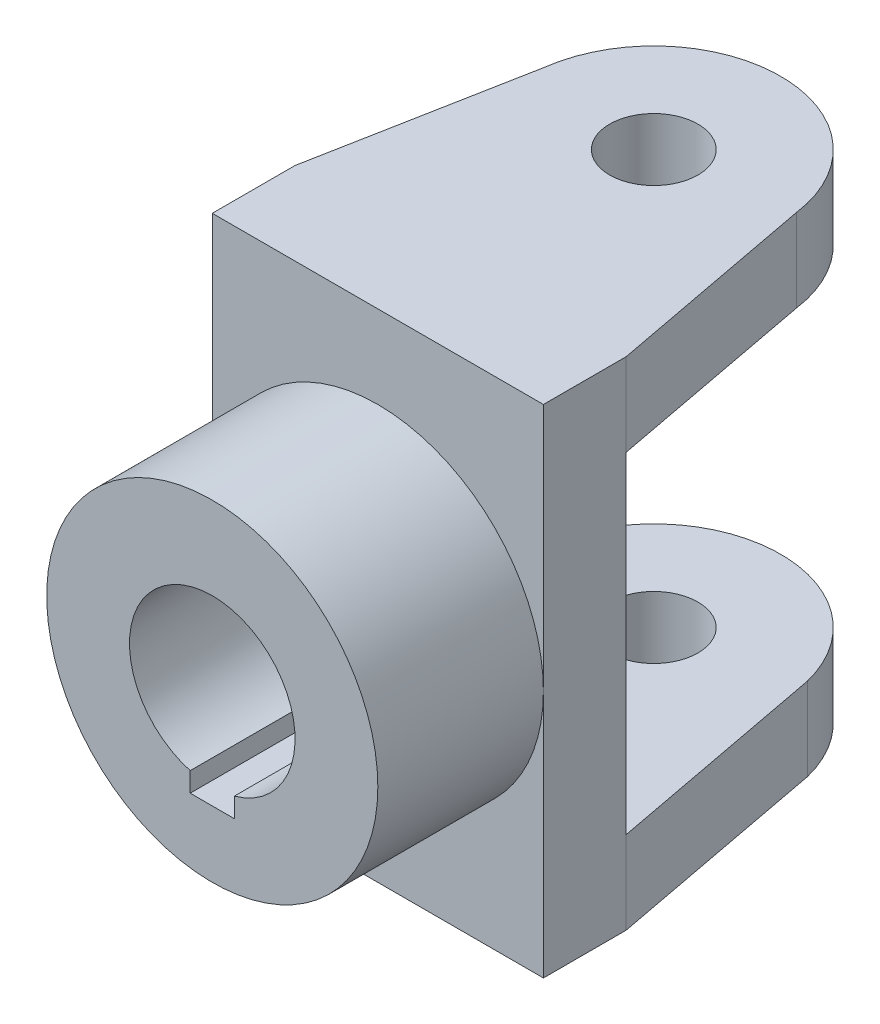
ISO-10303-21;
HEADER;
FILE_DESCRIPTION(('STEP AP214'),'2;1');
FILE_NAME('part.step','',(''),(''),'','','');
FILE_SCHEMA(('AUTOMOTIVE_DESIGN { 1 0 10303 214 1 1 1 1 }'));
ENDSEC;
DATA;
#1=APPLICATION_CONTEXT('core data for automotive mechanical design processes');
#2=APPLICATION_PROTOCOL_DEFINITION('international standard','automotive_design',2000,#1);
#3=PRODUCT_CONTEXT('',#1,'mechanical');
#4=PRODUCT('Part','Part','',(#3));
#5=PRODUCT_RELATED_PRODUCT_CATEGORY('part','',(#4));
#6=PRODUCT_DEFINITION_FORMATION('','',#4);
#7=PRODUCT_DEFINITION_CONTEXT('part definition',#1,'design');
#8=PRODUCT_DEFINITION('design','',#6,#7);
#9=PRODUCT_DEFINITION_SHAPE('','',#8);
#10=(LENGTH_UNIT() NAMED_UNIT(*) SI_UNIT(.MILLI.,.METRE.));
#11=(NAMED_UNIT(*) PLANE_ANGLE_UNIT() SI_UNIT($,.RADIAN.));
#12=(NAMED_UNIT(*) SI_UNIT($,.STERADIAN.) SOLID_ANGLE_UNIT());
#13=UNCERTAINTY_MEASURE_WITH_UNIT(LENGTH_MEASURE(1.E-05),#10,'distance_accuracy_value','');
#14=(GEOMETRIC_REPRESENTATION_CONTEXT(3) GLOBAL_UNCERTAINTY_ASSIGNED_CONTEXT((#13)) GLOBAL_UNIT_ASSIGNED_CONTEXT((#10,
#11,#12)) REPRESENTATION_CONTEXT('',''));
#15=CARTESIAN_POINT('',(0.,0.,0.));
#16=DIRECTION('',(0.,0.,1.));
#17=DIRECTION('',(1.,0.,0.));
#18=AXIS2_PLACEMENT_3D('',#15,#16,#17);
#19=CARTESIAN_POINT('',(0.,0.,0.));
#20=DIRECTION('',(0.,0.,1.));
#21=DIRECTION('',(1.,0.,0.));
#22=AXIS2_PLACEMENT_3D('',#19,#20,#21);
#23=PLANE('',#22);
#24=DIRECTION('',(1.,0.,0.));
#25=VECTOR('',#24,1.);
#26=CARTESIAN_POINT('',(0.,-30.,0.));
#27=LINE('',#26,#25);
#28=CARTESIAN_POINT('',(-30.,-30.,0.));
#29=VERTEX_POINT('',#28);
#30=CARTESIAN_POINT('',(30.,-30.,0.));
#31=VERTEX_POINT('',#30);
#32=EDGE_CURVE('E183',#29,#31,#27,.T.);
#33=ORIENTED_EDGE('',*,*,#32,.F.);
#34=DIRECTION('',(0.,-1.,0.));
#35=VECTOR('',#34,1.);
#36=CARTESIAN_POINT('',(-30.,45.,0.));
#37=LINE('',#36,#35);
#38=CARTESIAN_POINT('',(-30.,30.,0.));
#39=VERTEX_POINT('',#38);
#40=EDGE_CURVE('E335',#39,#29,#37,.T.);
#41=ORIENTED_EDGE('',*,*,#40,.F.);
#42=DIRECTION('',(1.,0.,0.));
#43=VECTOR('',#42,1.);
#44=CARTESIAN_POINT('',(-30.,30.,0.));
#45=LINE('',#44,#43);
#46=CARTESIAN_POINT('',(30.,30.,0.));
#47=VERTEX_POINT('',#46);
#48=EDGE_CURVE('E247',#39,#47,#45,.T.);
#49=ORIENTED_EDGE('',*,*,#48,.T.);
#50=DIRECTION('',(0.,1.,0.));
#51=VECTOR('',#50,1.);
#52=CARTESIAN_POINT('',(30.,45.,0.));
#53=LINE('',#52,#51);
#54=EDGE_CURVE('E76',#31,#47,#53,.T.);
#55=ORIENTED_EDGE('',*,*,#54,.F.);
#56=EDGE_LOOP('',(#33,#41,#49,#55));
#57=FACE_BOUND('',#56,.T.);
#58=ADVANCED_FACE('F58',(#57),#23,.F.);
#59=CARTESIAN_POINT('',(0.,0.,15.));
#60=DIRECTION('',(0.,0.,1.));
#61=DIRECTION('',(1.,0.,0.));
#62=AXIS2_PLACEMENT_3D('',#59,#60,#61);
#63=PLANE('',#62);
#64=CARTESIAN_POINT('',(0.,0.,15.));
#65=DIRECTION('',(0.,0.,1.));
#66=DIRECTION('',(1.,0.,0.));
#67=AXIS2_PLACEMENT_3D('',#64,#65,#66);
#68=CIRCLE('',#67,30.);
#69=CARTESIAN_POINT('',(30.,0.,15.));
#70=VERTEX_POINT('',#69);
#71=CARTESIAN_POINT('',(-30.,0.,15.));
#72=VERTEX_POINT('',#71);
#73=EDGE_CURVE('E69',#70,#72,#68,.T.);
#74=ORIENTED_EDGE('',*,*,#73,.F.);
#75=DIRECTION('',(0.,1.,0.));
#76=VECTOR('',#75,1.);
#77=CARTESIAN_POINT('',(30.,45.,15.));
#78=LINE('',#77,#76);
#79=CARTESIAN_POINT('',(30.,45.,15.));
#80=VERTEX_POINT('',#79);
#81=EDGE_CURVE('E320',#70,#80,#78,.T.);
#82=ORIENTED_EDGE('',*,*,#81,.T.);
#83=DIRECTION('',(-1.,0.,0.));
#84=VECTOR('',#83,1.);
#85=CARTESIAN_POINT('',(-30.,45.,15.));
#86=LINE('',#85,#84);
#87=CARTESIAN_POINT('',(-30.,45.,15.));
#88=VERTEX_POINT('',#87);
#89=EDGE_CURVE('E319',#80,#88,#86,.T.);
#90=ORIENTED_EDGE('',*,*,#89,.T.);
#91=DIRECTION('',(0.,-1.,0.));
#92=VECTOR('',#91,1.);
#93=CARTESIAN_POINT('',(-30.,45.,15.));
#94=LINE('',#93,#92);
#95=EDGE_CURVE('E324',#88,#72,#94,.T.);
#96=ORIENTED_EDGE('',*,*,#95,.T.);
#97=EDGE_LOOP('',(#74,#82,#90,#96));
#98=FACE_BOUND('',#97,.T.);
#99=ADVANCED_FACE('F410',(#98),#63,.T.);
#100=CARTESIAN_POINT('',(30.,45.,15.));
#101=DIRECTION('',(-1.,0.,0.));
#102=DIRECTION('',(0.,-1.,0.));
#103=AXIS2_PLACEMENT_3D('',#100,#101,#102);
#104=PLANE('',#103);
#105=CARTESIAN_POINT('',(30.,-45.,0.));
#106=VERTEX_POINT('',#105);
#107=EDGE_CURVE('E332',#106,#31,#53,.T.);
#108=ORIENTED_EDGE('',*,*,#107,.T.);
#109=ORIENTED_EDGE('',*,*,#54,.T.);
#110=DIRECTION('',(0.,1.,0.));
#111=VECTOR('',#110,1.);
#112=CARTESIAN_POINT('',(30.,30.,0.));
#113=LINE('',#112,#111);
#114=CARTESIAN_POINT('',(30.,45.,0.));
#115=VERTEX_POINT('',#114);
#116=EDGE_CURVE('E262',#47,#115,#113,.T.);
#117=ORIENTED_EDGE('',*,*,#116,.T.);
#118=DIRECTION('',(0.,0.,-1.));
#119=VECTOR('',#118,1.);
#120=CARTESIAN_POINT('',(30.,45.,15.));
#121=LINE('',#120,#119);
#122=EDGE_CURVE('E62',#80,#115,#121,.T.);
#123=ORIENTED_EDGE('',*,*,#122,.F.);
#124=ORIENTED_EDGE('',*,*,#81,.F.);
#125=CARTESIAN_POINT('',(30.,-45.,15.));
#126=VERTEX_POINT('',#125);
#127=EDGE_CURVE('E316',#126,#70,#78,.T.);
#128=ORIENTED_EDGE('',*,*,#127,.F.);
#129=DIRECTION('',(0.,0.,-1.));
#130=VECTOR('',#129,1.);
#131=CARTESIAN_POINT('',(30.,-45.,15.));
#132=LINE('',#131,#130);
#133=EDGE_CURVE('E331',#126,#106,#132,.T.);
#134=ORIENTED_EDGE('',*,*,#133,.T.);
#135=EDGE_LOOP('',(#108,#109,#117,#123,#124,#128,#134));
#136=FACE_BOUND('',#135,.T.);
#137=ADVANCED_FACE('F60',(#136),#104,.F.);
#138=CARTESIAN_POINT('',(-30.,45.,15.));
#139=DIRECTION('',(0.,-1.,0.));
#140=DIRECTION('',(0.,0.,-1.));
#141=AXIS2_PLACEMENT_3D('',#138,#139,#140);
#142=PLANE('',#141);
#143=ORIENTED_EDGE('',*,*,#122,.T.);
#144=DIRECTION('',(-0.185979050214473,0.,-0.982553709921917));
#145=VECTOR('',#144,1.);
#146=CARTESIAN_POINT('',(30.,45.,0.));
#147=LINE('',#146,#145);
#148=CARTESIAN_POINT('',(22.7945088201798,45.,-38.0676322541571));
#149=VERTEX_POINT('',#148);
#150=EDGE_CURVE('E231',#115,#149,#147,.T.);
#151=ORIENTED_EDGE('',*,*,#150,.T.);
#152=CARTESIAN_POINT('',(0.,45.,-35.));
#153=DIRECTION('',(0.,1.,0.));
#154=DIRECTION('',(0.,0.,1.));
#155=AXIS2_PLACEMENT_3D('',#152,#153,#154);
#156=CIRCLE('',#155,23.);
#157=CARTESIAN_POINT('',(-22.7945088201798,45.,-38.0676322541571));
#158=VERTEX_POINT('',#157);
#159=EDGE_CURVE('E255',#149,#158,#156,.T.);
#160=ORIENTED_EDGE('',*,*,#159,.T.);
#161=DIRECTION('',(0.185979050214473,0.,-0.982553709921917));
#162=VECTOR('',#161,1.);
#163=CARTESIAN_POINT('',(-30.,45.,0.));
#164=LINE('',#163,#162);
#165=CARTESIAN_POINT('',(-30.,45.,0.));
#166=VERTEX_POINT('',#165);
#167=EDGE_CURVE('E240',#166,#158,#164,.T.);
#168=ORIENTED_EDGE('',*,*,#167,.F.);
#169=DIRECTION('',(0.,0.,-1.));
#170=VECTOR('',#169,1.);
#171=CARTESIAN_POINT('',(-30.,45.,15.));
#172=LINE('',#171,#170);
#173=EDGE_CURVE('E346',#88,#166,#172,.T.);
#174=ORIENTED_EDGE('',*,*,#173,.F.);
#175=ORIENTED_EDGE('',*,*,#89,.F.);
#176=EDGE_LOOP('',(#143,#151,#160,#168,#174,#175));
#177=FACE_BOUND('',#176,.T.);
#178=CARTESIAN_POINT('',(0.,45.,-35.));
#179=DIRECTION('',(0.,1.,0.));
#180=DIRECTION('',(0.,0.,1.));
#181=AXIS2_PLACEMENT_3D('',#178,#179,#180);
#182=CIRCLE('',#181,8.);
#183=CARTESIAN_POINT('',(0.,45.,-27.));
#184=VERTEX_POINT('',#183);
#185=EDGE_CURVE('E224',#184,#184,#182,.T.);
#186=ORIENTED_EDGE('',*,*,#185,.F.);
#187=EDGE_LOOP('',(#186));
#188=FACE_BOUND('',#187,.T.);
#189=ADVANCED_FACE('F357',(#177,#188),#142,.F.);
#190=CARTESIAN_POINT('',(-30.,45.,15.));
#191=DIRECTION('',(1.,0.,0.));
#192=DIRECTION('',(0.,1.,0.));
#193=AXIS2_PLACEMENT_3D('',#190,#191,#192);
#194=PLANE('',#193);
#195=EDGE_CURVE('E336',#166,#39,#37,.T.);
#196=ORIENTED_EDGE('',*,*,#195,.T.);
#197=ORIENTED_EDGE('',*,*,#40,.T.);
#198=DIRECTION('',(0.,-1.,0.));
#199=VECTOR('',#198,1.);
#200=CARTESIAN_POINT('',(-30.,-30.,0.));
#201=LINE('',#200,#199);
#202=CARTESIAN_POINT('',(-30.,-45.,0.));
#203=VERTEX_POINT('',#202);
#204=EDGE_CURVE('E197',#29,#203,#201,.T.);
#205=ORIENTED_EDGE('',*,*,#204,.T.);
#206=DIRECTION('',(0.,0.,-1.));
#207=VECTOR('',#206,1.);
#208=CARTESIAN_POINT('',(-30.,-45.,15.));
#209=LINE('',#208,#207);
#210=CARTESIAN_POINT('',(-30.,-45.,15.));
#211=VERTEX_POINT('',#210);
#212=EDGE_CURVE('E343',#211,#203,#209,.T.);
#213=ORIENTED_EDGE('',*,*,#212,.F.);
#214=EDGE_CURVE('E323',#72,#211,#94,.T.);
#215=ORIENTED_EDGE('',*,*,#214,.F.);
#216=ORIENTED_EDGE('',*,*,#95,.F.);
#217=ORIENTED_EDGE('',*,*,#173,.T.);
#218=EDGE_LOOP('',(#196,#197,#205,#213,#215,#216,#217));
#219=FACE_BOUND('',#218,.T.);
#220=ADVANCED_FACE('F379',(#219),#194,.F.);
#221=CARTESIAN_POINT('',(-30.,-45.,15.));
#222=DIRECTION('',(0.,1.,0.));
#223=DIRECTION('',(-1.,0.,0.));
#224=AXIS2_PLACEMENT_3D('',#221,#222,#223);
#225=PLANE('',#224);
#226=ORIENTED_EDGE('',*,*,#212,.T.);
#227=DIRECTION('',(0.18604338521781,0.,-0.982541530326682));
#228=VECTOR('',#227,1.);
#229=CARTESIAN_POINT('',(-28.9616357645009,-45.,-5.48386057257191));
#230=LINE('',#229,#228);
#231=CARTESIAN_POINT('',(-22.3269092920646,-45.,-40.5235062654005));
#232=VERTEX_POINT('',#231);
#233=EDGE_CURVE('E214',#203,#232,#230,.T.);
#234=ORIENTED_EDGE('',*,*,#233,.T.);
#235=CARTESIAN_POINT('',(0.,-45.,-35.));
#236=DIRECTION('',(0.,-1.,0.));
#237=DIRECTION('',(1.,0.,0.));
#238=AXIS2_PLACEMENT_3D('',#235,#236,#237);
#239=CIRCLE('',#238,23.);
#240=CARTESIAN_POINT('',(22.3269092920646,-45.,-40.5235062654005));
#241=VERTEX_POINT('',#240);
#242=EDGE_CURVE('E177',#232,#241,#239,.T.);
#243=ORIENTED_EDGE('',*,*,#242,.T.);
#244=DIRECTION('',(-0.18604338521781,0.,-0.982541530326682));
#245=VECTOR('',#244,1.);
#246=CARTESIAN_POINT('',(28.9616357645009,-45.,-5.48386057257191));
#247=LINE('',#246,#245);
#248=EDGE_CURVE('E203',#106,#241,#247,.T.);
#249=ORIENTED_EDGE('',*,*,#248,.F.);
#250=ORIENTED_EDGE('',*,*,#133,.F.);
#251=DIRECTION('',(1.,0.,0.));
#252=VECTOR('',#251,1.);
#253=CARTESIAN_POINT('',(-30.,-45.,15.));
#254=LINE('',#253,#252);
#255=EDGE_CURVE('E328',#211,#126,#254,.T.);
#256=ORIENTED_EDGE('',*,*,#255,.F.);
#257=EDGE_LOOP('',(#226,#234,#243,#249,#250,#256));
#258=FACE_BOUND('',#257,.T.);
#259=CARTESIAN_POINT('',(0.,-45.,-35.));
#260=DIRECTION('',(0.,-1.,0.));
#261=DIRECTION('',(1.,0.,0.));
#262=AXIS2_PLACEMENT_3D('',#259,#260,#261);
#263=CIRCLE('',#262,8.);
#264=CARTESIAN_POINT('',(7.99999999999999,-45.,-35.));
#265=VERTEX_POINT('',#264);
#266=EDGE_CURVE('E210',#265,#265,#263,.T.);
#267=ORIENTED_EDGE('',*,*,#266,.F.);
#268=EDGE_LOOP('',(#267));
#269=FACE_BOUND('',#268,.T.);
#270=ADVANCED_FACE('F391',(#258,#269),#225,.F.);
#271=EDGE_CURVE('E12',#72,#70,#68,.T.);
#272=ORIENTED_EDGE('',*,*,#271,.F.);
#273=ORIENTED_EDGE('',*,*,#214,.T.);
#274=ORIENTED_EDGE('',*,*,#255,.T.);
#275=ORIENTED_EDGE('',*,*,#127,.T.);
#276=EDGE_LOOP('',(#272,#273,#274,#275));
#277=FACE_BOUND('',#276,.T.);
#278=ADVANCED_FACE('F387',(#277),#63,.T.);
#279=CARTESIAN_POINT('',(0.,0.,45.));
#280=DIRECTION('',(0.,0.,1.));
#281=DIRECTION('',(1.,0.,0.));
#282=AXIS2_PLACEMENT_3D('',#279,#280,#281);
#283=PLANE('',#282);
#284=DIRECTION('',(0.,-1.,0.));
#285=VECTOR('',#284,1.);
#286=CARTESIAN_POINT('',(-4.,-14.456832294801,45.));
#287=LINE('',#286,#285);
#288=CARTESIAN_POINT('',(-4.,-14.456832294801,45.));
#289=VERTEX_POINT('',#288);
#290=CARTESIAN_POINT('',(-4.,-18.,45.));
#291=VERTEX_POINT('',#290);
#292=EDGE_CURVE('E265',#289,#291,#287,.T.);
#293=ORIENTED_EDGE('',*,*,#292,.F.);
#294=CARTESIAN_POINT('',(0.,0.,45.));
#295=DIRECTION('',(0.,0.,1.));
#296=DIRECTION('',(1.,0.,0.));
#297=AXIS2_PLACEMENT_3D('',#294,#295,#296);
#298=CIRCLE('',#297,15.);
#299=CARTESIAN_POINT('',(4.,-14.456832294801,45.));
#300=VERTEX_POINT('',#299);
#301=EDGE_CURVE('E304',#300,#289,#298,.T.);
#302=ORIENTED_EDGE('',*,*,#301,.F.);
#303=DIRECTION('',(0.,1.,0.));
#304=VECTOR('',#303,1.);
#305=CARTESIAN_POINT('',(4.,-14.456832294801,45.));
#306=LINE('',#305,#304);
#307=CARTESIAN_POINT('',(4.,-18.,45.));
#308=VERTEX_POINT('',#307);
#309=EDGE_CURVE('E276',#308,#300,#306,.T.);
#310=ORIENTED_EDGE('',*,*,#309,.F.);
#311=DIRECTION('',(1.,0.,0.));
#312=VECTOR('',#311,1.);
#313=CARTESIAN_POINT('',(-4.,-18.,45.));
#314=LINE('',#313,#312);
#315=EDGE_CURVE('E285',#291,#308,#314,.T.);
#316=ORIENTED_EDGE('',*,*,#315,.F.);
#317=EDGE_LOOP('',(#293,#302,#310,#316));
#318=FACE_BOUND('',#317,.T.);
#319=CARTESIAN_POINT('',(0.,0.,45.));
#320=DIRECTION('',(0.,0.,1.));
#321=DIRECTION('',(1.,0.,0.));
#322=AXIS2_PLACEMENT_3D('',#319,#320,#321);
#323=CIRCLE('',#322,30.);
#324=CARTESIAN_POINT('',(30.,0.,45.));
#325=VERTEX_POINT('',#324);
#326=EDGE_CURVE('E310',#325,#325,#323,.T.);
#327=ORIENTED_EDGE('',*,*,#326,.T.);
#328=EDGE_LOOP('',(#327));
#329=FACE_BOUND('',#328,.T.);
#330=ADVANCED_FACE('F445',(#318,#329),#283,.T.);
#331=CARTESIAN_POINT('',(0.,0.,45.));
#332=DIRECTION('',(0.,0.,-1.));
#333=DIRECTION('',(-1.,0.,0.));
#334=AXIS2_PLACEMENT_3D('',#331,#332,#333);
#335=CYLINDRICAL_SURFACE('',#334,30.);
#336=ORIENTED_EDGE('',*,*,#326,.F.);
#337=EDGE_LOOP('',(#336));
#338=FACE_BOUND('',#337,.T.);
#339=ORIENTED_EDGE('',*,*,#73,.T.);
#340=ORIENTED_EDGE('',*,*,#271,.T.);
#341=EDGE_LOOP('',(#339,#340));
#342=FACE_BOUND('',#341,.T.);
#343=ADVANCED_FACE('F453',(#338,#342),#335,.T.);
#344=CARTESIAN_POINT('',(0.,0.,45.));
#345=DIRECTION('',(0.,0.,-1.));
#346=DIRECTION('',(-1.,0.,0.));
#347=AXIS2_PLACEMENT_3D('',#344,#345,#346);
#348=CYLINDRICAL_SURFACE('',#347,15.);
#349=DIRECTION('',(0.,0.,1.));
#350=VECTOR('',#349,1.);
#351=CARTESIAN_POINT('',(-4.,-14.456832294801,15.));
#352=LINE('',#351,#350);
#353=CARTESIAN_POINT('',(-4.,-14.456832294801,15.));
#354=VERTEX_POINT('',#353);
#355=EDGE_CURVE('E291',#354,#289,#352,.T.);
#356=ORIENTED_EDGE('',*,*,#355,.F.);
#357=CARTESIAN_POINT('',(0.,0.,15.));
#358=DIRECTION('',(0.,0.,1.));
#359=DIRECTION('',(1.,0.,0.));
#360=AXIS2_PLACEMENT_3D('',#357,#358,#359);
#361=CIRCLE('',#360,15.);
#362=CARTESIAN_POINT('',(4.,-14.456832294801,15.));
#363=VERTEX_POINT('',#362);
#364=EDGE_CURVE('E294',#363,#354,#361,.T.);
#365=ORIENTED_EDGE('',*,*,#364,.F.);
#366=DIRECTION('',(0.,0.,1.));
#367=VECTOR('',#366,1.);
#368=CARTESIAN_POINT('',(4.,-14.456832294801,15.));
#369=LINE('',#368,#367);
#370=EDGE_CURVE('E295',#363,#300,#369,.T.);
#371=ORIENTED_EDGE('',*,*,#370,.T.);
#372=ORIENTED_EDGE('',*,*,#301,.T.);
#373=EDGE_LOOP('',(#356,#365,#371,#372));
#374=FACE_BOUND('',#373,.T.);
#375=ADVANCED_FACE('F458',(#374),#348,.F.);
#376=ORIENTED_EDGE('',*,*,#364,.T.);
#377=DIRECTION('',(0.,-1.,0.));
#378=VECTOR('',#377,1.);
#379=CARTESIAN_POINT('',(-4.,-14.456832294801,15.));
#380=LINE('',#379,#378);
#381=CARTESIAN_POINT('',(-4.,-18.,15.));
#382=VERTEX_POINT('',#381);
#383=EDGE_CURVE('E271',#354,#382,#380,.T.);
#384=ORIENTED_EDGE('',*,*,#383,.T.);
#385=DIRECTION('',(1.,0.,0.));
#386=VECTOR('',#385,1.);
#387=CARTESIAN_POINT('',(-4.,-18.,15.));
#388=LINE('',#387,#386);
#389=CARTESIAN_POINT('',(4.,-18.,15.));
#390=VERTEX_POINT('',#389);
#391=EDGE_CURVE('E275',#382,#390,#388,.T.);
#392=ORIENTED_EDGE('',*,*,#391,.T.);
#393=DIRECTION('',(0.,1.,0.));
#394=VECTOR('',#393,1.);
#395=CARTESIAN_POINT('',(4.,-14.456832294801,15.));
#396=LINE('',#395,#394);
#397=EDGE_CURVE('E84',#390,#363,#396,.T.);
#398=ORIENTED_EDGE('',*,*,#397,.T.);
#399=EDGE_LOOP('',(#376,#384,#392,#398));
#400=FACE_BOUND('',#399,.T.);
#401=ADVANCED_FACE('F417',(#400),#63,.T.);
#402=CARTESIAN_POINT('',(-4.,-14.456832294801,15.));
#403=DIRECTION('',(-1.,0.,0.));
#404=DIRECTION('',(0.,0.,1.));
#405=AXIS2_PLACEMENT_3D('',#402,#403,#404);
#406=PLANE('',#405);
#407=ORIENTED_EDGE('',*,*,#292,.T.);
#408=DIRECTION('',(0.,0.,1.));
#409=VECTOR('',#408,1.);
#410=CARTESIAN_POINT('',(-4.,-18.,15.));
#411=LINE('',#410,#409);
#412=EDGE_CURVE('E281',#382,#291,#411,.T.);
#413=ORIENTED_EDGE('',*,*,#412,.F.);
#414=ORIENTED_EDGE('',*,*,#383,.F.);
#415=ORIENTED_EDGE('',*,*,#355,.T.);
#416=EDGE_LOOP('',(#407,#413,#414,#415));
#417=FACE_BOUND('',#416,.T.);
#418=ADVANCED_FACE('F486',(#417),#406,.F.);
#419=CARTESIAN_POINT('',(4.,-14.456832294801,15.));
#420=DIRECTION('',(1.,0.,0.));
#421=DIRECTION('',(0.,0.,-1.));
#422=AXIS2_PLACEMENT_3D('',#419,#420,#421);
#423=PLANE('',#422);
#424=ORIENTED_EDGE('',*,*,#309,.T.);
#425=ORIENTED_EDGE('',*,*,#370,.F.);
#426=ORIENTED_EDGE('',*,*,#397,.F.);
#427=DIRECTION('',(0.,0.,1.));
#428=VECTOR('',#427,1.);
#429=CARTESIAN_POINT('',(4.,-18.,15.));
#430=LINE('',#429,#428);
#431=EDGE_CURVE('E299',#390,#308,#430,.T.);
#432=ORIENTED_EDGE('',*,*,#431,.T.);
#433=EDGE_LOOP('',(#424,#425,#426,#432));
#434=FACE_BOUND('',#433,.T.);
#435=ADVANCED_FACE('F494',(#434),#423,.F.);
#436=CARTESIAN_POINT('',(-4.,-18.,15.));
#437=DIRECTION('',(0.,-1.,0.));
#438=DIRECTION('',(0.,0.,-1.));
#439=AXIS2_PLACEMENT_3D('',#436,#437,#438);
#440=PLANE('',#439);
#441=ORIENTED_EDGE('',*,*,#315,.T.);
#442=ORIENTED_EDGE('',*,*,#431,.F.);
#443=ORIENTED_EDGE('',*,*,#391,.F.);
#444=ORIENTED_EDGE('',*,*,#412,.T.);
#445=EDGE_LOOP('',(#441,#442,#443,#444));
#446=FACE_BOUND('',#445,.T.);
#447=ADVANCED_FACE('F505',(#446),#440,.F.);
#448=CARTESIAN_POINT('',(30.,30.,0.));
#449=DIRECTION('',(0.982553709921917,0.,-0.185979050214473));
#450=DIRECTION('',(-0.185979050214473,0.,-0.982553709921917));
#451=AXIS2_PLACEMENT_3D('',#448,#449,#450);
#452=PLANE('',#451);
#453=ORIENTED_EDGE('',*,*,#150,.F.);
#454=ORIENTED_EDGE('',*,*,#116,.F.);
#455=DIRECTION('',(-0.185979050214473,0.,-0.982553709921917));
#456=VECTOR('',#455,1.);
#457=CARTESIAN_POINT('',(30.,30.,0.));
#458=LINE('',#457,#456);
#459=CARTESIAN_POINT('',(22.7945088201798,30.,-38.0676322541571));
#460=VERTEX_POINT('',#459);
#461=EDGE_CURVE('E235',#47,#460,#458,.T.);
#462=ORIENTED_EDGE('',*,*,#461,.T.);
#463=DIRECTION('',(0.,1.,0.));
#464=VECTOR('',#463,1.);
#465=CARTESIAN_POINT('',(22.7945088201798,30.,-38.0676322541571));
#466=LINE('',#465,#464);
#467=EDGE_CURVE('E251',#460,#149,#466,.T.);
#468=ORIENTED_EDGE('',*,*,#467,.T.);
#469=EDGE_LOOP('',(#453,#454,#462,#468));
#470=FACE_BOUND('',#469,.T.);
#471=ADVANCED_FACE('F364',(#470),#452,.T.);
#472=CARTESIAN_POINT('',(-30.,30.,0.));
#473=DIRECTION('',(0.982553709921917,0.,0.185979050214473));
#474=DIRECTION('',(0.185979050214473,0.,-0.982553709921917));
#475=AXIS2_PLACEMENT_3D('',#472,#473,#474);
#476=PLANE('',#475);
#477=ORIENTED_EDGE('',*,*,#167,.T.);
#478=DIRECTION('',(0.,1.,0.));
#479=VECTOR('',#478,1.);
#480=CARTESIAN_POINT('',(-22.7945088201798,30.,-38.0676322541571));
#481=LINE('',#480,#479);
#482=CARTESIAN_POINT('',(-22.7945088201798,30.,-38.0676322541571));
#483=VERTEX_POINT('',#482);
#484=EDGE_CURVE('E266',#483,#158,#481,.T.);
#485=ORIENTED_EDGE('',*,*,#484,.F.);
#486=DIRECTION('',(0.185979050214473,0.,-0.982553709921917));
#487=VECTOR('',#486,1.);
#488=CARTESIAN_POINT('',(-30.,30.,0.));
#489=LINE('',#488,#487);
#490=EDGE_CURVE('E244',#39,#483,#489,.T.);
#491=ORIENTED_EDGE('',*,*,#490,.F.);
#492=ORIENTED_EDGE('',*,*,#195,.F.);
#493=EDGE_LOOP('',(#477,#485,#491,#492));
#494=FACE_BOUND('',#493,.T.);
#495=ADVANCED_FACE('F378',(#494),#476,.F.);
#496=CARTESIAN_POINT('',(0.,30.,-35.));
#497=DIRECTION('',(0.,1.,0.));
#498=DIRECTION('',(0.,0.,1.));
#499=AXIS2_PLACEMENT_3D('',#496,#497,#498);
#500=CYLINDRICAL_SURFACE('',#499,23.);
#501=ORIENTED_EDGE('',*,*,#159,.F.);
#502=ORIENTED_EDGE('',*,*,#467,.F.);
#503=CARTESIAN_POINT('',(0.,30.,-35.));
#504=DIRECTION('',(0.,1.,0.));
#505=DIRECTION('',(0.,0.,1.));
#506=AXIS2_PLACEMENT_3D('',#503,#504,#505);
#507=CIRCLE('',#506,23.);
#508=EDGE_CURVE('E239',#460,#483,#507,.T.);
#509=ORIENTED_EDGE('',*,*,#508,.T.);
#510=ORIENTED_EDGE('',*,*,#484,.T.);
#511=EDGE_LOOP('',(#501,#502,#509,#510));
#512=FACE_BOUND('',#511,.T.);
#513=ADVANCED_FACE('F375',(#512),#500,.T.);
#514=CARTESIAN_POINT('',(0.,30.,-35.));
#515=DIRECTION('',(0.,1.,0.));
#516=DIRECTION('',(0.,0.,1.));
#517=AXIS2_PLACEMENT_3D('',#514,#515,#516);
#518=PLANE('',#517);
#519=CARTESIAN_POINT('',(0.,30.,-35.));
#520=DIRECTION('',(0.,1.,0.));
#521=DIRECTION('',(0.,0.,1.));
#522=AXIS2_PLACEMENT_3D('',#519,#520,#521);
#523=CIRCLE('',#522,8.);
#524=CARTESIAN_POINT('',(0.,30.,-27.));
#525=VERTEX_POINT('',#524);
#526=EDGE_CURVE('E227',#525,#525,#523,.T.);
#527=ORIENTED_EDGE('',*,*,#526,.T.);
#528=EDGE_LOOP('',(#527));
#529=FACE_BOUND('',#528,.T.);
#530=ORIENTED_EDGE('',*,*,#461,.F.);
#531=ORIENTED_EDGE('',*,*,#48,.F.);
#532=ORIENTED_EDGE('',*,*,#490,.T.);
#533=ORIENTED_EDGE('',*,*,#508,.F.);
#534=EDGE_LOOP('',(#530,#531,#532,#533));
#535=FACE_BOUND('',#534,.T.);
#536=ADVANCED_FACE('F370',(#529,#535),#518,.F.);
#537=CARTESIAN_POINT('',(0.,30.,-35.));
#538=DIRECTION('',(0.,1.,0.));
#539=DIRECTION('',(0.,0.,1.));
#540=AXIS2_PLACEMENT_3D('',#537,#538,#539);
#541=CYLINDRICAL_SURFACE('',#540,8.);
#542=ORIENTED_EDGE('',*,*,#526,.F.);
#543=EDGE_LOOP('',(#542));
#544=FACE_BOUND('',#543,.T.);
#545=ORIENTED_EDGE('',*,*,#185,.T.);
#546=EDGE_LOOP('',(#545));
#547=FACE_BOUND('',#546,.T.);
#548=ADVANCED_FACE('F405',(#544,#547),#541,.F.);
#549=CARTESIAN_POINT('',(-28.9616357645009,-30.,-5.48386057257191));
#550=DIRECTION('',(-0.982541530326682,0.,-0.18604338521781));
#551=DIRECTION('',(-0.18604338521781,0.,0.982541530326682));
#552=AXIS2_PLACEMENT_3D('',#549,#550,#551);
#553=PLANE('',#552);
#554=ORIENTED_EDGE('',*,*,#233,.F.);
#555=ORIENTED_EDGE('',*,*,#204,.F.);
#556=DIRECTION('',(0.18604338521781,0.,-0.982541530326682));
#557=VECTOR('',#556,1.);
#558=CARTESIAN_POINT('',(-28.9616357645009,-30.,-5.48386057257191));
#559=LINE('',#558,#557);
#560=CARTESIAN_POINT('',(-22.3269092920646,-30.,-40.5235062654005));
#561=VERTEX_POINT('',#560);
#562=EDGE_CURVE('E189',#29,#561,#559,.T.);
#563=ORIENTED_EDGE('',*,*,#562,.T.);
#564=DIRECTION('',(0.,-1.,0.));
#565=VECTOR('',#564,1.);
#566=CARTESIAN_POINT('',(-22.3269092920646,-30.,-40.5235062654005));
#567=LINE('',#566,#565);
#568=EDGE_CURVE('E172',#561,#232,#567,.T.);
#569=ORIENTED_EDGE('',*,*,#568,.T.);
#570=EDGE_LOOP('',(#554,#555,#563,#569));
#571=FACE_BOUND('',#570,.T.);
#572=ADVANCED_FACE('F195',(#571),#553,.T.);
#573=CARTESIAN_POINT('',(28.9616357645009,-30.,-5.48386057257191));
#574=DIRECTION('',(-0.982541530326682,0.,0.18604338521781));
#575=DIRECTION('',(0.18604338521781,0.,0.982541530326682));
#576=AXIS2_PLACEMENT_3D('',#573,#574,#575);
#577=PLANE('',#576);
#578=ORIENTED_EDGE('',*,*,#248,.T.);
#579=DIRECTION('',(0.,-1.,0.));
#580=VECTOR('',#579,1.);
#581=CARTESIAN_POINT('',(22.3269092920646,-30.,-40.5235062654005));
#582=LINE('',#581,#580);
#583=CARTESIAN_POINT('',(22.3269092920646,-30.,-40.5235062654005));
#584=VERTEX_POINT('',#583);
#585=EDGE_CURVE('E182',#584,#241,#582,.T.);
#586=ORIENTED_EDGE('',*,*,#585,.F.);
#587=DIRECTION('',(-0.18604338521781,0.,-0.982541530326682));
#588=VECTOR('',#587,1.);
#589=CARTESIAN_POINT('',(28.9616357645009,-30.,-5.48386057257191));
#590=LINE('',#589,#588);
#591=EDGE_CURVE('E191',#31,#584,#590,.T.);
#592=ORIENTED_EDGE('',*,*,#591,.F.);
#593=ORIENTED_EDGE('',*,*,#107,.F.);
#594=EDGE_LOOP('',(#578,#586,#592,#593));
#595=FACE_BOUND('',#594,.T.);
#596=ADVANCED_FACE('F395',(#595),#577,.F.);
#597=CARTESIAN_POINT('',(0.,-30.,-35.));
#598=DIRECTION('',(0.,-1.,0.));
#599=DIRECTION('',(1.,0.,0.));
#600=AXIS2_PLACEMENT_3D('',#597,#598,#599);
#601=CYLINDRICAL_SURFACE('',#600,8.);
#602=CARTESIAN_POINT('',(0.,-30.,-35.));
#603=DIRECTION('',(0.,-1.,0.));
#604=DIRECTION('',(1.,0.,0.));
#605=AXIS2_PLACEMENT_3D('',#602,#603,#604);
#606=CIRCLE('',#605,8.);
#607=CARTESIAN_POINT('',(7.99999999999999,-30.,-35.));
#608=VERTEX_POINT('',#607);
#609=EDGE_CURVE('E199',#608,#608,#606,.T.);
#610=ORIENTED_EDGE('',*,*,#609,.F.);
#611=EDGE_LOOP('',(#610));
#612=FACE_BOUND('',#611,.T.);
#613=ORIENTED_EDGE('',*,*,#266,.T.);
#614=EDGE_LOOP('',(#613));
#615=FACE_BOUND('',#614,.T.);
#616=ADVANCED_FACE('F397',(#612,#615),#601,.F.);
#617=CARTESIAN_POINT('',(0.,-30.,-35.));
#618=DIRECTION('',(0.,-1.,0.));
#619=DIRECTION('',(1.,0.,0.));
#620=AXIS2_PLACEMENT_3D('',#617,#618,#619);
#621=CYLINDRICAL_SURFACE('',#620,23.);
#622=ORIENTED_EDGE('',*,*,#242,.F.);
#623=ORIENTED_EDGE('',*,*,#568,.F.);
#624=CARTESIAN_POINT('',(0.,-30.,-35.));
#625=DIRECTION('',(0.,-1.,0.));
#626=DIRECTION('',(1.,0.,0.));
#627=AXIS2_PLACEMENT_3D('',#624,#625,#626);
#628=CIRCLE('',#627,23.);
#629=EDGE_CURVE('E175',#561,#584,#628,.T.);
#630=ORIENTED_EDGE('',*,*,#629,.T.);
#631=ORIENTED_EDGE('',*,*,#585,.T.);
#632=EDGE_LOOP('',(#622,#623,#630,#631));
#633=FACE_BOUND('',#632,.T.);
#634=ADVANCED_FACE('F174',(#633),#621,.T.);
#635=CARTESIAN_POINT('',(0.,-30.,0.));
#636=DIRECTION('',(0.,-1.,0.));
#637=DIRECTION('',(1.,0.,0.));
#638=AXIS2_PLACEMENT_3D('',#635,#636,#637);
#639=PLANE('',#638);
#640=ORIENTED_EDGE('',*,*,#609,.T.);
#641=EDGE_LOOP('',(#640));
#642=FACE_BOUND('',#641,.T.);
#643=ORIENTED_EDGE('',*,*,#562,.F.);
#644=ORIENTED_EDGE('',*,*,#32,.T.);
#645=ORIENTED_EDGE('',*,*,#591,.T.);
#646=ORIENTED_EDGE('',*,*,#629,.F.);
#647=EDGE_LOOP('',(#643,#644,#645,#646));
#648=FACE_BOUND('',#647,.T.);
#649=ADVANCED_FACE('F187',(#642,#648),#639,.F.);
#650=CLOSED_SHELL('',(#58,#99,#137,#189,#220,#270,#278,#330,#343,#375,#401,#418,#435,#447,#471,
#495,#513,#536,#548,#572,#596,#616,#634,#649));
#651=MANIFOLD_SOLID_BREP('B2',#650);
#652=ADVANCED_BREP_SHAPE_REPRESENTATION('',(#18,#651),#14);
#653=SHAPE_DEFINITION_REPRESENTATION(#9,#652);
ENDSEC;
END-ISO-10303-21;
